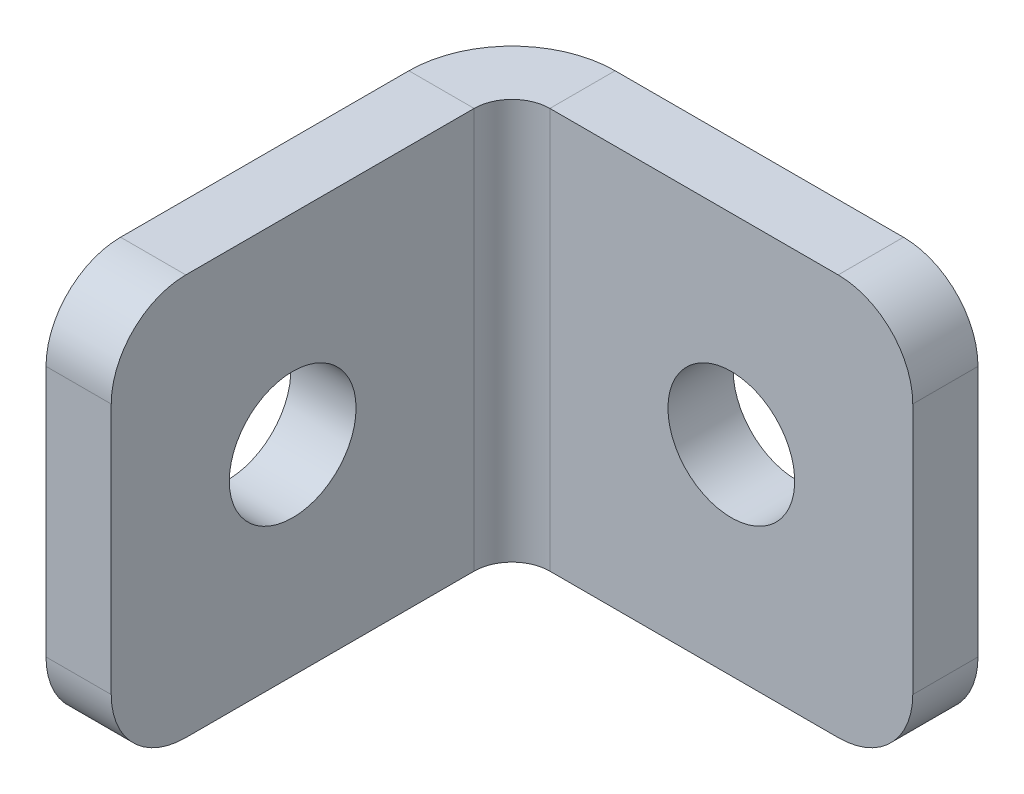
ISO-10303-21;
HEADER;
FILE_DESCRIPTION(('STEP AP214'),'2;1');
FILE_NAME('part.step','',(''),(''),'','','');
FILE_SCHEMA(('AUTOMOTIVE_DESIGN { 1 0 10303 214 1 1 1 1 }'));
ENDSEC;
DATA;
#1=APPLICATION_CONTEXT('core data for automotive mechanical design processes');
#2=APPLICATION_PROTOCOL_DEFINITION('international standard','automotive_design',2000,#1);
#3=PRODUCT_CONTEXT('',#1,'mechanical');
#4=PRODUCT('Part','Part','',(#3));
#5=PRODUCT_RELATED_PRODUCT_CATEGORY('part','',(#4));
#6=PRODUCT_DEFINITION_FORMATION('','',#4);
#7=PRODUCT_DEFINITION_CONTEXT('part definition',#1,'design');
#8=PRODUCT_DEFINITION('design','',#6,#7);
#9=PRODUCT_DEFINITION_SHAPE('','',#8);
#10=(LENGTH_UNIT() NAMED_UNIT(*) SI_UNIT(.MILLI.,.METRE.));
#11=(NAMED_UNIT(*) PLANE_ANGLE_UNIT() SI_UNIT($,.RADIAN.));
#12=(NAMED_UNIT(*) SI_UNIT($,.STERADIAN.) SOLID_ANGLE_UNIT());
#13=UNCERTAINTY_MEASURE_WITH_UNIT(LENGTH_MEASURE(1.E-05),#10,'distance_accuracy_value','');
#14=(GEOMETRIC_REPRESENTATION_CONTEXT(3) GLOBAL_UNCERTAINTY_ASSIGNED_CONTEXT((#13)) GLOBAL_UNIT_ASSIGNED_CONTEXT((#10,
#11,#12)) REPRESENTATION_CONTEXT('',''));
#15=CARTESIAN_POINT('',(0.,0.,0.));
#16=DIRECTION('',(0.,0.,1.));
#17=DIRECTION('',(1.,0.,0.));
#18=AXIS2_PLACEMENT_3D('',#15,#16,#17);
#19=CARTESIAN_POINT('',(0.,0.,-1.75));
#20=DIRECTION('',(0.,-1.,0.));
#21=DIRECTION('',(0.,0.,-1.));
#22=AXIS2_PLACEMENT_3D('',#19,#20,#21);
#23=PLANE('',#22);
#24=DIRECTION('',(1.,0.,0.));
#25=VECTOR('',#24,1.);
#26=CARTESIAN_POINT('',(0.,0.,-1.75));
#27=LINE('',#26,#25);
#28=CARTESIAN_POINT('',(1.016,0.,-1.75));
#29=VERTEX_POINT('',#28);
#30=CARTESIAN_POINT('',(8.75,0.,-1.75));
#31=VERTEX_POINT('',#30);
#32=EDGE_CURVE('E247',#29,#31,#27,.T.);
#33=ORIENTED_EDGE('',*,*,#32,.T.);
#34=DIRECTION('',(0.,0.,1.));
#35=VECTOR('',#34,1.);
#36=CARTESIAN_POINT('',(8.75,0.,-1.75));
#37=LINE('',#36,#35);
#38=CARTESIAN_POINT('',(8.75,0.,0.));
#39=VERTEX_POINT('',#38);
#40=EDGE_CURVE('E287',#31,#39,#37,.T.);
#41=ORIENTED_EDGE('',*,*,#40,.T.);
#42=DIRECTION('',(1.,0.,0.));
#43=VECTOR('',#42,1.);
#44=CARTESIAN_POINT('',(0.,0.,0.));
#45=LINE('',#44,#43);
#46=CARTESIAN_POINT('',(1.016,0.,0.));
#47=VERTEX_POINT('',#46);
#48=EDGE_CURVE('E245',#47,#39,#45,.T.);
#49=ORIENTED_EDGE('',*,*,#48,.F.);
#50=DIRECTION('',(0.,0.,-1.));
#51=VECTOR('',#50,1.);
#52=CARTESIAN_POINT('',(1.016,0.,0.));
#53=LINE('',#52,#51);
#54=EDGE_CURVE('E231',#47,#29,#53,.T.);
#55=ORIENTED_EDGE('',*,*,#54,.T.);
#56=EDGE_LOOP('',(#33,#41,#49,#55));
#57=FACE_BOUND('',#56,.T.);
#58=ADVANCED_FACE('F51',(#57),#23,.T.);
#59=CARTESIAN_POINT('',(0.,0.,-1.75));
#60=DIRECTION('',(0.,0.,-1.));
#61=DIRECTION('',(-1.,0.,0.));
#62=AXIS2_PLACEMENT_3D('',#59,#60,#61);
#63=PLANE('',#62);
#64=CARTESIAN_POINT('',(5.883,5.375,-1.75));
#65=DIRECTION('',(0.,0.,-1.));
#66=DIRECTION('',(-1.,0.,0.));
#67=AXIS2_PLACEMENT_3D('',#64,#65,#66);
#68=CIRCLE('',#67,1.69999999999999);
#69=CARTESIAN_POINT('',(4.18300000000001,5.375,-1.75));
#70=VERTEX_POINT('',#69);
#71=EDGE_CURVE('E353',#70,#70,#68,.T.);
#72=ORIENTED_EDGE('',*,*,#71,.F.);
#73=EDGE_LOOP('',(#72));
#74=FACE_BOUND('',#73,.T.);
#75=DIRECTION('',(0.,1.,0.));
#76=VECTOR('',#75,1.);
#77=CARTESIAN_POINT('',(10.75,0.,-1.75));
#78=LINE('',#77,#76);
#79=CARTESIAN_POINT('',(10.75,2.,-1.75));
#80=VERTEX_POINT('',#79);
#81=CARTESIAN_POINT('',(10.75,8.75,-1.75));
#82=VERTEX_POINT('',#81);
#83=EDGE_CURVE('E251',#80,#82,#78,.T.);
#84=ORIENTED_EDGE('',*,*,#83,.F.);
#85=CARTESIAN_POINT('',(8.75,2.,-1.75));
#86=DIRECTION('',(0.,0.,-1.));
#87=DIRECTION('',(-1.,0.,0.));
#88=AXIS2_PLACEMENT_3D('',#85,#86,#87);
#89=CIRCLE('',#88,2.);
#90=EDGE_CURVE('E59',#80,#31,#89,.T.);
#91=ORIENTED_EDGE('',*,*,#90,.T.);
#92=ORIENTED_EDGE('',*,*,#32,.F.);
#93=DIRECTION('',(0.,-1.,0.));
#94=VECTOR('',#93,1.);
#95=CARTESIAN_POINT('',(1.016,0.,-1.75));
#96=LINE('',#95,#94);
#97=CARTESIAN_POINT('',(1.016,10.75,-1.75));
#98=VERTEX_POINT('',#97);
#99=EDGE_CURVE('E175',#29,#98,#96,.F.);
#100=ORIENTED_EDGE('',*,*,#99,.T.);
#101=DIRECTION('',(-1.,0.,0.));
#102=VECTOR('',#101,1.);
#103=CARTESIAN_POINT('',(0.,10.75,-1.75));
#104=LINE('',#103,#102);
#105=CARTESIAN_POINT('',(8.75,10.75,-1.75));
#106=VERTEX_POINT('',#105);
#107=EDGE_CURVE('E255',#106,#98,#104,.T.);
#108=ORIENTED_EDGE('',*,*,#107,.F.);
#109=CARTESIAN_POINT('',(8.75,8.75,-1.75));
#110=DIRECTION('',(0.,0.,-1.));
#111=DIRECTION('',(-1.,0.,0.));
#112=AXIS2_PLACEMENT_3D('',#109,#110,#111);
#113=CIRCLE('',#112,2.);
#114=EDGE_CURVE('E79',#106,#82,#113,.T.);
#115=ORIENTED_EDGE('',*,*,#114,.T.);
#116=EDGE_LOOP('',(#84,#91,#92,#100,#108,#115));
#117=FACE_BOUND('',#116,.T.);
#118=ADVANCED_FACE('F306',(#74,#117),#63,.T.);
#119=CARTESIAN_POINT('',(0.,0.,0.));
#120=DIRECTION('',(0.,0.,-1.));
#121=DIRECTION('',(-1.,0.,0.));
#122=AXIS2_PLACEMENT_3D('',#119,#120,#121);
#123=PLANE('',#122);
#124=CARTESIAN_POINT('',(5.883,5.375,0.));
#125=DIRECTION('',(0.,0.,-1.));
#126=DIRECTION('',(-1.,0.,0.));
#127=AXIS2_PLACEMENT_3D('',#124,#125,#126);
#128=CIRCLE('',#127,1.69999999999999);
#129=CARTESIAN_POINT('',(4.183,5.375,0.));
#130=VERTEX_POINT('',#129);
#131=EDGE_CURVE('E348',#130,#130,#128,.T.);
#132=ORIENTED_EDGE('',*,*,#131,.T.);
#133=EDGE_LOOP('',(#132));
#134=FACE_BOUND('',#133,.T.);
#135=ORIENTED_EDGE('',*,*,#48,.T.);
#136=CARTESIAN_POINT('',(8.75,2.,0.));
#137=DIRECTION('',(0.,0.,-1.));
#138=DIRECTION('',(-1.,0.,0.));
#139=AXIS2_PLACEMENT_3D('',#136,#137,#138);
#140=CIRCLE('',#139,2.);
#141=CARTESIAN_POINT('',(10.75,2.,0.));
#142=VERTEX_POINT('',#141);
#143=EDGE_CURVE('E293',#39,#142,#140,.F.);
#144=ORIENTED_EDGE('',*,*,#143,.T.);
#145=DIRECTION('',(0.,1.,0.));
#146=VECTOR('',#145,1.);
#147=CARTESIAN_POINT('',(10.75,0.,0.));
#148=LINE('',#147,#146);
#149=CARTESIAN_POINT('',(10.75,8.75,0.));
#150=VERTEX_POINT('',#149);
#151=EDGE_CURVE('E262',#142,#150,#148,.T.);
#152=ORIENTED_EDGE('',*,*,#151,.T.);
#153=CARTESIAN_POINT('',(8.75,8.75,0.));
#154=DIRECTION('',(0.,0.,-1.));
#155=DIRECTION('',(-1.,0.,0.));
#156=AXIS2_PLACEMENT_3D('',#153,#154,#155);
#157=CIRCLE('',#156,2.);
#158=CARTESIAN_POINT('',(8.75,10.75,0.));
#159=VERTEX_POINT('',#158);
#160=EDGE_CURVE('E290',#150,#159,#157,.F.);
#161=ORIENTED_EDGE('',*,*,#160,.T.);
#162=DIRECTION('',(-1.,0.,0.));
#163=VECTOR('',#162,1.);
#164=CARTESIAN_POINT('',(0.,10.75,0.));
#165=LINE('',#164,#163);
#166=CARTESIAN_POINT('',(1.016,10.75,0.));
#167=VERTEX_POINT('',#166);
#168=EDGE_CURVE('E252',#159,#167,#165,.T.);
#169=ORIENTED_EDGE('',*,*,#168,.T.);
#170=DIRECTION('',(0.,-1.,0.));
#171=VECTOR('',#170,1.);
#172=CARTESIAN_POINT('',(1.016,0.,0.));
#173=LINE('',#172,#171);
#174=EDGE_CURVE('E236',#47,#167,#173,.F.);
#175=ORIENTED_EDGE('',*,*,#174,.F.);
#176=EDGE_LOOP('',(#135,#144,#152,#161,#169,#175));
#177=FACE_BOUND('',#176,.T.);
#178=ADVANCED_FACE('F315',(#134,#177),#123,.F.);
#179=CARTESIAN_POINT('',(0.,10.75,-1.75));
#180=DIRECTION('',(0.,1.,0.));
#181=DIRECTION('',(0.,0.,1.));
#182=AXIS2_PLACEMENT_3D('',#179,#180,#181);
#183=PLANE('',#182);
#184=ORIENTED_EDGE('',*,*,#168,.F.);
#185=DIRECTION('',(0.,0.,1.));
#186=VECTOR('',#185,1.);
#187=CARTESIAN_POINT('',(8.75,10.75,-1.75));
#188=LINE('',#187,#186);
#189=EDGE_CURVE('E12',#159,#106,#188,.F.);
#190=ORIENTED_EDGE('',*,*,#189,.T.);
#191=ORIENTED_EDGE('',*,*,#107,.T.);
#192=DIRECTION('',(0.,0.,-1.));
#193=VECTOR('',#192,1.);
#194=CARTESIAN_POINT('',(1.016,10.75,0.));
#195=LINE('',#194,#193);
#196=EDGE_CURVE('E242',#167,#98,#195,.T.);
#197=ORIENTED_EDGE('',*,*,#196,.F.);
#198=EDGE_LOOP('',(#184,#190,#191,#197));
#199=FACE_BOUND('',#198,.T.);
#200=ADVANCED_FACE('F322',(#199),#183,.T.);
#201=CARTESIAN_POINT('',(10.75,0.,-1.75));
#202=DIRECTION('',(1.,0.,0.));
#203=DIRECTION('',(0.,0.,-1.));
#204=AXIS2_PLACEMENT_3D('',#201,#202,#203);
#205=PLANE('',#204);
#206=ORIENTED_EDGE('',*,*,#151,.F.);
#207=DIRECTION('',(0.,0.,1.));
#208=VECTOR('',#207,1.);
#209=CARTESIAN_POINT('',(10.75,2.,-1.75));
#210=LINE('',#209,#208);
#211=EDGE_CURVE('E299',#142,#80,#210,.F.);
#212=ORIENTED_EDGE('',*,*,#211,.T.);
#213=ORIENTED_EDGE('',*,*,#83,.T.);
#214=DIRECTION('',(0.,0.,1.));
#215=VECTOR('',#214,1.);
#216=CARTESIAN_POINT('',(10.75,8.75,-1.75));
#217=LINE('',#216,#215);
#218=EDGE_CURVE('E296',#82,#150,#217,.T.);
#219=ORIENTED_EDGE('',*,*,#218,.T.);
#220=EDGE_LOOP('',(#206,#212,#213,#219));
#221=FACE_BOUND('',#220,.T.);
#222=ADVANCED_FACE('F318',(#221),#205,.T.);
#223=CARTESIAN_POINT('',(1.016,10.75,1.016));
#224=DIRECTION('',(0.,1.,0.));
#225=DIRECTION('',(0.,0.,1.));
#226=AXIS2_PLACEMENT_3D('',#223,#224,#225);
#227=PLANE('',#226);
#228=DIRECTION('',(-1.,0.,0.));
#229=VECTOR('',#228,1.);
#230=CARTESIAN_POINT('',(0.,10.75,1.016));
#231=LINE('',#230,#229);
#232=CARTESIAN_POINT('',(0.,10.75,1.016));
#233=VERTEX_POINT('',#232);
#234=CARTESIAN_POINT('',(-1.75,10.75,1.01599999999999));
#235=VERTEX_POINT('',#234);
#236=EDGE_CURVE('E328',#233,#235,#231,.T.);
#237=ORIENTED_EDGE('',*,*,#236,.F.);
#238=CARTESIAN_POINT('',(1.016,10.75,1.016));
#239=DIRECTION('',(0.,-1.,0.));
#240=DIRECTION('',(0.,0.,-1.));
#241=AXIS2_PLACEMENT_3D('',#238,#239,#240);
#242=CIRCLE('',#241,1.016);
#243=EDGE_CURVE('E179',#167,#233,#242,.F.);
#244=ORIENTED_EDGE('',*,*,#243,.F.);
#245=ORIENTED_EDGE('',*,*,#196,.T.);
#246=CARTESIAN_POINT('',(1.016,10.75,1.016));
#247=DIRECTION('',(0.,-1.,0.));
#248=DIRECTION('',(0.,0.,-1.));
#249=AXIS2_PLACEMENT_3D('',#246,#247,#248);
#250=CIRCLE('',#249,2.766);
#251=EDGE_CURVE('E229',#98,#235,#250,.F.);
#252=ORIENTED_EDGE('',*,*,#251,.T.);
#253=EDGE_LOOP('',(#237,#244,#245,#252));
#254=FACE_BOUND('',#253,.T.);
#255=ADVANCED_FACE('F326',(#254),#227,.T.);
#256=CARTESIAN_POINT('',(1.016,0.,1.016));
#257=DIRECTION('',(0.,1.,0.));
#258=DIRECTION('',(0.,0.,1.));
#259=AXIS2_PLACEMENT_3D('',#256,#257,#258);
#260=PLANE('',#259);
#261=CARTESIAN_POINT('',(1.016,0.,1.016));
#262=DIRECTION('',(0.,-1.,0.));
#263=DIRECTION('',(0.,0.,-1.));
#264=AXIS2_PLACEMENT_3D('',#261,#262,#263);
#265=CIRCLE('',#264,1.016);
#266=CARTESIAN_POINT('',(0.,0.,1.016));
#267=VERTEX_POINT('',#266);
#268=EDGE_CURVE('E186',#267,#47,#265,.T.);
#269=ORIENTED_EDGE('',*,*,#268,.F.);
#270=DIRECTION('',(-1.,0.,0.));
#271=VECTOR('',#270,1.);
#272=CARTESIAN_POINT('',(0.,0.,1.016));
#273=LINE('',#272,#271);
#274=CARTESIAN_POINT('',(-1.75,0.,1.01599999999999));
#275=VERTEX_POINT('',#274);
#276=EDGE_CURVE('E183',#267,#275,#273,.T.);
#277=ORIENTED_EDGE('',*,*,#276,.T.);
#278=CARTESIAN_POINT('',(1.016,0.,1.016));
#279=DIRECTION('',(0.,-1.,0.));
#280=DIRECTION('',(0.,0.,-1.));
#281=AXIS2_PLACEMENT_3D('',#278,#279,#280);
#282=CIRCLE('',#281,2.766);
#283=EDGE_CURVE('E167',#275,#29,#282,.T.);
#284=ORIENTED_EDGE('',*,*,#283,.T.);
#285=ORIENTED_EDGE('',*,*,#54,.F.);
#286=EDGE_LOOP('',(#269,#277,#284,#285));
#287=FACE_BOUND('',#286,.T.);
#288=ADVANCED_FACE('F184',(#287),#260,.F.);
#289=CARTESIAN_POINT('',(1.016,0.,1.016));
#290=DIRECTION('',(0.,-1.,0.));
#291=DIRECTION('',(-1.,0.,0.));
#292=AXIS2_PLACEMENT_3D('',#289,#290,#291);
#293=CYLINDRICAL_SURFACE('',#292,2.766);
#294=ORIENTED_EDGE('',*,*,#99,.F.);
#295=ORIENTED_EDGE('',*,*,#283,.F.);
#296=DIRECTION('',(0.,1.,0.));
#297=VECTOR('',#296,1.);
#298=CARTESIAN_POINT('',(-1.75,0.,1.01599999999999));
#299=LINE('',#298,#297);
#300=EDGE_CURVE('E172',#275,#235,#299,.T.);
#301=ORIENTED_EDGE('',*,*,#300,.T.);
#302=ORIENTED_EDGE('',*,*,#251,.F.);
#303=EDGE_LOOP('',(#294,#295,#301,#302));
#304=FACE_BOUND('',#303,.T.);
#305=ADVANCED_FACE('F169',(#304),#293,.T.);
#306=CARTESIAN_POINT('',(1.016,0.,1.016));
#307=DIRECTION('',(0.,-1.,0.));
#308=DIRECTION('',(-1.,0.,0.));
#309=AXIS2_PLACEMENT_3D('',#306,#307,#308);
#310=CYLINDRICAL_SURFACE('',#309,1.016);
#311=ORIENTED_EDGE('',*,*,#174,.T.);
#312=ORIENTED_EDGE('',*,*,#243,.T.);
#313=DIRECTION('',(0.,-1.,0.));
#314=VECTOR('',#313,1.);
#315=CARTESIAN_POINT('',(0.,10.75,1.016));
#316=LINE('',#315,#314);
#317=EDGE_CURVE('E191',#233,#267,#316,.T.);
#318=ORIENTED_EDGE('',*,*,#317,.T.);
#319=ORIENTED_EDGE('',*,*,#268,.T.);
#320=EDGE_LOOP('',(#311,#312,#318,#319));
#321=FACE_BOUND('',#320,.T.);
#322=ADVANCED_FACE('F331',(#321),#310,.F.);
#323=CARTESIAN_POINT('',(-1.75000000000004,0.,10.75));
#324=DIRECTION('',(0.,1.,0.));
#325=DIRECTION('',(0.,0.,1.));
#326=AXIS2_PLACEMENT_3D('',#323,#324,#325);
#327=PLANE('',#326);
#328=DIRECTION('',(0.,0.,1.));
#329=VECTOR('',#328,1.);
#330=CARTESIAN_POINT('',(0.,0.,10.75));
#331=LINE('',#330,#329);
#332=CARTESIAN_POINT('',(0.,0.,8.75));
#333=VERTEX_POINT('',#332);
#334=EDGE_CURVE('E201',#267,#333,#331,.T.);
#335=ORIENTED_EDGE('',*,*,#334,.T.);
#336=DIRECTION('',(1.,0.,0.));
#337=VECTOR('',#336,1.);
#338=CARTESIAN_POINT('',(-1.75000000000003,0.,8.74999999999999));
#339=LINE('',#338,#337);
#340=CARTESIAN_POINT('',(-1.75000000000003,0.,8.74999999999999));
#341=VERTEX_POINT('',#340);
#342=EDGE_CURVE('E205',#333,#341,#339,.F.);
#343=ORIENTED_EDGE('',*,*,#342,.T.);
#344=DIRECTION('',(0.,0.,1.));
#345=VECTOR('',#344,1.);
#346=CARTESIAN_POINT('',(-1.75000000000004,0.,10.75));
#347=LINE('',#346,#345);
#348=EDGE_CURVE('E196',#275,#341,#347,.T.);
#349=ORIENTED_EDGE('',*,*,#348,.F.);
#350=ORIENTED_EDGE('',*,*,#276,.F.);
#351=EDGE_LOOP('',(#335,#343,#349,#350));
#352=FACE_BOUND('',#351,.T.);
#353=ADVANCED_FACE('F203',(#352),#327,.F.);
#354=CARTESIAN_POINT('',(-1.75,10.75,0.));
#355=DIRECTION('',(0.,-1.,0.));
#356=DIRECTION('',(0.,0.,-1.));
#357=AXIS2_PLACEMENT_3D('',#354,#355,#356);
#358=PLANE('',#357);
#359=DIRECTION('',(0.,0.,-1.));
#360=VECTOR('',#359,1.);
#361=CARTESIAN_POINT('',(-1.75,10.75,0.));
#362=LINE('',#361,#360);
#363=CARTESIAN_POINT('',(-1.75000000000003,10.75,8.74999999999999));
#364=VERTEX_POINT('',#363);
#365=EDGE_CURVE('E199',#364,#235,#362,.T.);
#366=ORIENTED_EDGE('',*,*,#365,.F.);
#367=DIRECTION('',(1.,0.,0.));
#368=VECTOR('',#367,1.);
#369=CARTESIAN_POINT('',(-1.75000000000003,10.75,8.74999999999999));
#370=LINE('',#369,#368);
#371=CARTESIAN_POINT('',(0.,10.75,8.75));
#372=VERTEX_POINT('',#371);
#373=EDGE_CURVE('E284',#364,#372,#370,.T.);
#374=ORIENTED_EDGE('',*,*,#373,.T.);
#375=DIRECTION('',(0.,0.,-1.));
#376=VECTOR('',#375,1.);
#377=CARTESIAN_POINT('',(0.,10.75,0.));
#378=LINE('',#377,#376);
#379=EDGE_CURVE('E208',#372,#233,#378,.T.);
#380=ORIENTED_EDGE('',*,*,#379,.T.);
#381=ORIENTED_EDGE('',*,*,#236,.T.);
#382=EDGE_LOOP('',(#366,#374,#380,#381));
#383=FACE_BOUND('',#382,.T.);
#384=ADVANCED_FACE('F433',(#383),#358,.F.);
#385=CARTESIAN_POINT('',(-1.75,0.,0.));
#386=DIRECTION('',(1.,0.,0.));
#387=DIRECTION('',(0.,0.,-1.));
#388=AXIS2_PLACEMENT_3D('',#385,#386,#387);
#389=PLANE('',#388);
#390=CARTESIAN_POINT('',(-1.75000000000002,5.375,5.88299999999999));
#391=DIRECTION('',(-1.,0.,0.));
#392=DIRECTION('',(0.,0.,1.));
#393=AXIS2_PLACEMENT_3D('',#390,#391,#392);
#394=CIRCLE('',#393,1.69999999999999);
#395=CARTESIAN_POINT('',(-1.75000000000003,5.375,7.58299999999998));
#396=VERTEX_POINT('',#395);
#397=EDGE_CURVE('E344',#396,#396,#394,.T.);
#398=ORIENTED_EDGE('',*,*,#397,.F.);
#399=EDGE_LOOP('',(#398));
#400=FACE_BOUND('',#399,.T.);
#401=ORIENTED_EDGE('',*,*,#348,.T.);
#402=CARTESIAN_POINT('',(-1.75000000000003,2.,8.74999999999999));
#403=DIRECTION('',(1.,0.,0.));
#404=DIRECTION('',(0.,0.,-1.));
#405=AXIS2_PLACEMENT_3D('',#402,#403,#404);
#406=CIRCLE('',#405,2.);
#407=CARTESIAN_POINT('',(-1.75000000000004,2.,10.75));
#408=VERTEX_POINT('',#407);
#409=EDGE_CURVE('E282',#341,#408,#406,.F.);
#410=ORIENTED_EDGE('',*,*,#409,.T.);
#411=DIRECTION('',(0.,1.,0.));
#412=VECTOR('',#411,1.);
#413=CARTESIAN_POINT('',(-1.75000000000004,10.75,10.75));
#414=LINE('',#413,#412);
#415=CARTESIAN_POINT('',(-1.75000000000004,8.75,10.75));
#416=VERTEX_POINT('',#415);
#417=EDGE_CURVE('E207',#408,#416,#414,.T.);
#418=ORIENTED_EDGE('',*,*,#417,.T.);
#419=CARTESIAN_POINT('',(-1.75000000000003,8.75,8.74999999999999));
#420=DIRECTION('',(1.,0.,0.));
#421=DIRECTION('',(0.,0.,-1.));
#422=AXIS2_PLACEMENT_3D('',#419,#420,#421);
#423=CIRCLE('',#422,2.);
#424=EDGE_CURVE('E279',#416,#364,#423,.F.);
#425=ORIENTED_EDGE('',*,*,#424,.T.);
#426=ORIENTED_EDGE('',*,*,#365,.T.);
#427=ORIENTED_EDGE('',*,*,#300,.F.);
#428=EDGE_LOOP('',(#401,#410,#418,#425,#426,#427));
#429=FACE_BOUND('',#428,.T.);
#430=ADVANCED_FACE('F195',(#400,#429),#389,.F.);
#431=CARTESIAN_POINT('',(0.,0.,0.));
#432=DIRECTION('',(1.,0.,0.));
#433=DIRECTION('',(0.,0.,-1.));
#434=AXIS2_PLACEMENT_3D('',#431,#432,#433);
#435=PLANE('',#434);
#436=CARTESIAN_POINT('',(0.,5.375,5.883));
#437=DIRECTION('',(1.,0.,0.));
#438=DIRECTION('',(0.,0.,-1.));
#439=AXIS2_PLACEMENT_3D('',#436,#437,#438);
#440=CIRCLE('',#439,1.69999999999999);
#441=CARTESIAN_POINT('',(0.,5.375,4.183));
#442=VERTEX_POINT('',#441);
#443=EDGE_CURVE('E339',#442,#442,#440,.T.);
#444=ORIENTED_EDGE('',*,*,#443,.F.);
#445=EDGE_LOOP('',(#444));
#446=FACE_BOUND('',#445,.T.);
#447=DIRECTION('',(0.,1.,0.));
#448=VECTOR('',#447,1.);
#449=CARTESIAN_POINT('',(0.,10.75,10.75));
#450=LINE('',#449,#448);
#451=CARTESIAN_POINT('',(0.,2.,10.75));
#452=VERTEX_POINT('',#451);
#453=CARTESIAN_POINT('',(0.,8.75,10.75));
#454=VERTEX_POINT('',#453);
#455=EDGE_CURVE('E217',#452,#454,#450,.T.);
#456=ORIENTED_EDGE('',*,*,#455,.F.);
#457=CARTESIAN_POINT('',(0.,2.,8.75));
#458=DIRECTION('',(1.,0.,0.));
#459=DIRECTION('',(0.,0.,-1.));
#460=AXIS2_PLACEMENT_3D('',#457,#458,#459);
#461=CIRCLE('',#460,2.);
#462=EDGE_CURVE('E275',#452,#333,#461,.T.);
#463=ORIENTED_EDGE('',*,*,#462,.T.);
#464=ORIENTED_EDGE('',*,*,#334,.F.);
#465=ORIENTED_EDGE('',*,*,#317,.F.);
#466=ORIENTED_EDGE('',*,*,#379,.F.);
#467=CARTESIAN_POINT('',(0.,8.75,8.75));
#468=DIRECTION('',(1.,0.,0.));
#469=DIRECTION('',(0.,0.,-1.));
#470=AXIS2_PLACEMENT_3D('',#467,#468,#469);
#471=CIRCLE('',#470,2.);
#472=EDGE_CURVE('E272',#372,#454,#471,.T.);
#473=ORIENTED_EDGE('',*,*,#472,.T.);
#474=EDGE_LOOP('',(#456,#463,#464,#465,#466,#473));
#475=FACE_BOUND('',#474,.T.);
#476=ADVANCED_FACE('F335',(#446,#475),#435,.T.);
#477=CARTESIAN_POINT('',(-1.75000000000004,10.75,10.75));
#478=DIRECTION('',(0.,0.,-1.));
#479=DIRECTION('',(-1.,0.,0.));
#480=AXIS2_PLACEMENT_3D('',#477,#478,#479);
#481=PLANE('',#480);
#482=ORIENTED_EDGE('',*,*,#417,.F.);
#483=DIRECTION('',(1.,0.,0.));
#484=VECTOR('',#483,1.);
#485=CARTESIAN_POINT('',(-1.75000000000004,2.,10.75));
#486=LINE('',#485,#484);
#487=EDGE_CURVE('E269',#408,#452,#486,.T.);
#488=ORIENTED_EDGE('',*,*,#487,.T.);
#489=ORIENTED_EDGE('',*,*,#455,.T.);
#490=DIRECTION('',(1.,0.,0.));
#491=VECTOR('',#490,1.);
#492=CARTESIAN_POINT('',(-1.75000000000004,8.75,10.75));
#493=LINE('',#492,#491);
#494=EDGE_CURVE('E258',#454,#416,#493,.F.);
#495=ORIENTED_EDGE('',*,*,#494,.T.);
#496=EDGE_LOOP('',(#482,#488,#489,#495));
#497=FACE_BOUND('',#496,.T.);
#498=ADVANCED_FACE('F421',(#497),#481,.F.);
#499=CARTESIAN_POINT('',(-1.75000000000002,5.375,5.88299999999999));
#500=DIRECTION('',(-1.,0.,0.));
#501=DIRECTION('',(0.,0.,1.));
#502=AXIS2_PLACEMENT_3D('',#499,#500,#501);
#503=CYLINDRICAL_SURFACE('',#502,1.69999999999999);
#504=ORIENTED_EDGE('',*,*,#397,.T.);
#505=EDGE_LOOP('',(#504));
#506=FACE_BOUND('',#505,.T.);
#507=ORIENTED_EDGE('',*,*,#443,.T.);
#508=EDGE_LOOP('',(#507));
#509=FACE_BOUND('',#508,.T.);
#510=ADVANCED_FACE('F418',(#506,#509),#503,.F.);
#511=CARTESIAN_POINT('',(5.883,5.375,-1.75));
#512=DIRECTION('',(0.,0.,-1.));
#513=DIRECTION('',(-1.,0.,0.));
#514=AXIS2_PLACEMENT_3D('',#511,#512,#513);
#515=CYLINDRICAL_SURFACE('',#514,1.69999999999999);
#516=ORIENTED_EDGE('',*,*,#131,.F.);
#517=EDGE_LOOP('',(#516));
#518=FACE_BOUND('',#517,.T.);
#519=ORIENTED_EDGE('',*,*,#71,.T.);
#520=EDGE_LOOP('',(#519));
#521=FACE_BOUND('',#520,.T.);
#522=ADVANCED_FACE('F359',(#518,#521),#515,.F.);
#523=CARTESIAN_POINT('',(-1.75000000000003,2.,8.74999999999999));
#524=DIRECTION('',(1.,0.,0.));
#525=DIRECTION('',(0.,0.,-1.));
#526=AXIS2_PLACEMENT_3D('',#523,#524,#525);
#527=CYLINDRICAL_SURFACE('',#526,2.);
#528=ORIENTED_EDGE('',*,*,#409,.F.);
#529=ORIENTED_EDGE('',*,*,#342,.F.);
#530=ORIENTED_EDGE('',*,*,#462,.F.);
#531=ORIENTED_EDGE('',*,*,#487,.F.);
#532=EDGE_LOOP('',(#528,#529,#530,#531));
#533=FACE_BOUND('',#532,.T.);
#534=ADVANCED_FACE('F377',(#533),#527,.T.);
#535=CARTESIAN_POINT('',(-1.75000000000003,8.75,8.74999999999999));
#536=DIRECTION('',(1.,0.,0.));
#537=DIRECTION('',(0.,0.,-1.));
#538=AXIS2_PLACEMENT_3D('',#535,#536,#537);
#539=CYLINDRICAL_SURFACE('',#538,2.);
#540=ORIENTED_EDGE('',*,*,#424,.F.);
#541=ORIENTED_EDGE('',*,*,#494,.F.);
#542=ORIENTED_EDGE('',*,*,#472,.F.);
#543=ORIENTED_EDGE('',*,*,#373,.F.);
#544=EDGE_LOOP('',(#540,#541,#542,#543));
#545=FACE_BOUND('',#544,.T.);
#546=ADVANCED_FACE('F380',(#545),#539,.T.);
#547=CARTESIAN_POINT('',(8.75,2.,-1.75));
#548=DIRECTION('',(0.,0.,1.));
#549=DIRECTION('',(1.,0.,0.));
#550=AXIS2_PLACEMENT_3D('',#547,#548,#549);
#551=CYLINDRICAL_SURFACE('',#550,2.);
#552=ORIENTED_EDGE('',*,*,#90,.F.);
#553=ORIENTED_EDGE('',*,*,#211,.F.);
#554=ORIENTED_EDGE('',*,*,#143,.F.);
#555=ORIENTED_EDGE('',*,*,#40,.F.);
#556=EDGE_LOOP('',(#552,#553,#554,#555));
#557=FACE_BOUND('',#556,.T.);
#558=ADVANCED_FACE('F312',(#557),#551,.T.);
#559=CARTESIAN_POINT('',(8.75,8.75,-1.75));
#560=DIRECTION('',(0.,0.,1.));
#561=DIRECTION('',(1.,0.,0.));
#562=AXIS2_PLACEMENT_3D('',#559,#560,#561);
#563=CYLINDRICAL_SURFACE('',#562,2.);
#564=ORIENTED_EDGE('',*,*,#114,.F.);
#565=ORIENTED_EDGE('',*,*,#189,.F.);
#566=ORIENTED_EDGE('',*,*,#160,.F.);
#567=ORIENTED_EDGE('',*,*,#218,.F.);
#568=EDGE_LOOP('',(#564,#565,#566,#567));
#569=FACE_BOUND('',#568,.T.);
#570=ADVANCED_FACE('F53',(#569),#563,.T.);
#571=CLOSED_SHELL('',(#58,#118,#178,#200,#222,#255,#288,#305,#322,#353,#384,#430,#476,#498,#510,
#522,#534,#546,#558,#570));
#572=MANIFOLD_SOLID_BREP('B2',#571);
#573=ADVANCED_BREP_SHAPE_REPRESENTATION('',(#18,#572),#14);
#574=SHAPE_DEFINITION_REPRESENTATION(#9,#573);
ENDSEC;
END-ISO-10303-21;
